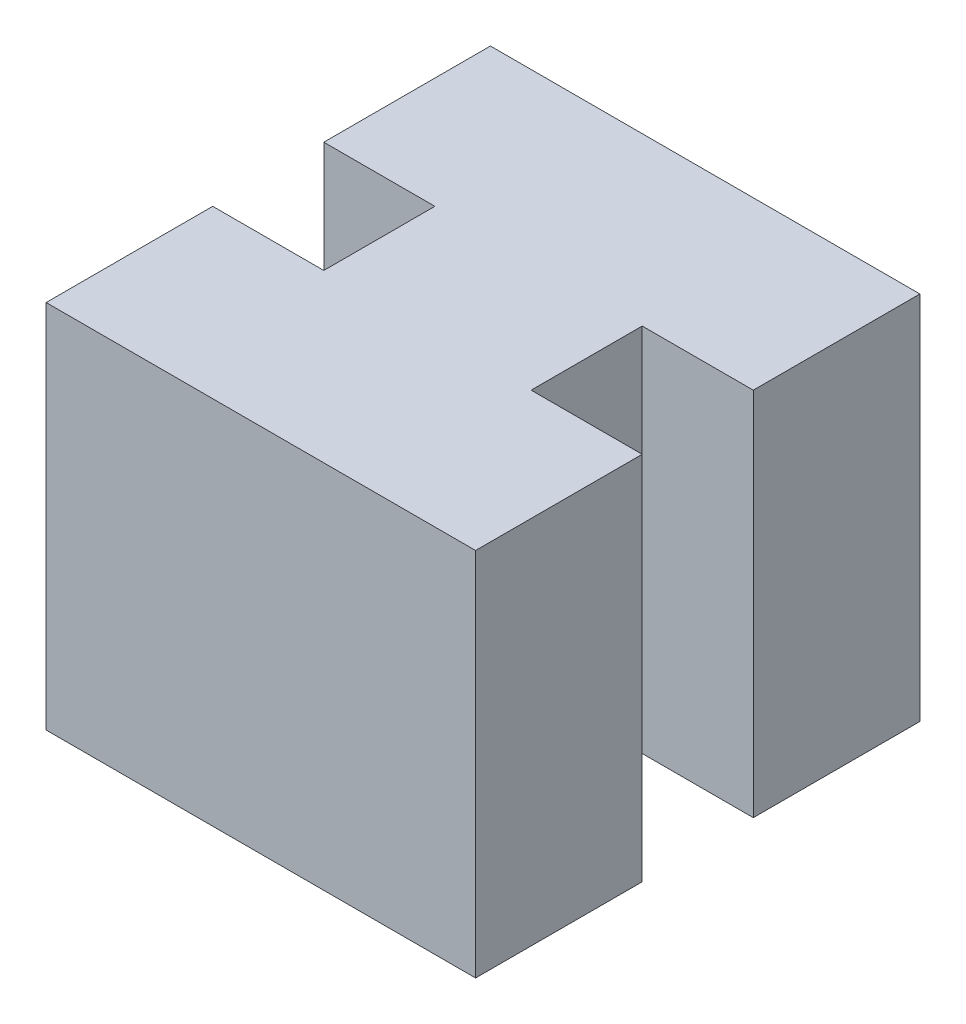
ISO-10303-21;
HEADER;
FILE_DESCRIPTION(('STEP AP214'),'2;1');
FILE_NAME('part.step','',(''),(''),'','','');
FILE_SCHEMA(('AUTOMOTIVE_DESIGN { 1 0 10303 214 1 1 1 1 }'));
ENDSEC;
DATA;
#1=APPLICATION_CONTEXT('core data for automotive mechanical design processes');
#2=APPLICATION_PROTOCOL_DEFINITION('international standard','automotive_design',2000,#1);
#3=PRODUCT_CONTEXT('',#1,'mechanical');
#4=PRODUCT('Part','Part','',(#3));
#5=PRODUCT_RELATED_PRODUCT_CATEGORY('part','',(#4));
#6=PRODUCT_DEFINITION_FORMATION('','',#4);
#7=PRODUCT_DEFINITION_CONTEXT('part definition',#1,'design');
#8=PRODUCT_DEFINITION('design','',#6,#7);
#9=PRODUCT_DEFINITION_SHAPE('','',#8);
#10=(LENGTH_UNIT() NAMED_UNIT(*) SI_UNIT(.MILLI.,.METRE.));
#11=(NAMED_UNIT(*) PLANE_ANGLE_UNIT() SI_UNIT($,.RADIAN.));
#12=(NAMED_UNIT(*) SI_UNIT($,.STERADIAN.) SOLID_ANGLE_UNIT());
#13=UNCERTAINTY_MEASURE_WITH_UNIT(LENGTH_MEASURE(1.E-05),#10,'distance_accuracy_value','');
#14=(GEOMETRIC_REPRESENTATION_CONTEXT(3) GLOBAL_UNCERTAINTY_ASSIGNED_CONTEXT((#13)) GLOBAL_UNIT_ASSIGNED_CONTEXT((#10,
#11,#12)) REPRESENTATION_CONTEXT('',''));
#15=CARTESIAN_POINT('',(0.,0.,0.));
#16=DIRECTION('',(0.,0.,1.));
#17=DIRECTION('',(1.,0.,0.));
#18=AXIS2_PLACEMENT_3D('',#15,#16,#17);
#19=CARTESIAN_POINT('',(0.,2.5,0.75));
#20=DIRECTION('',(0.,0.,-1.));
#21=DIRECTION('',(-1.,0.,0.));
#22=AXIS2_PLACEMENT_3D('',#19,#20,#21);
#23=PLANE('',#22);
#24=DIRECTION('',(1.,0.,0.));
#25=VECTOR('',#24,1.);
#26=CARTESIAN_POINT('',(0.,-2.5,0.75));
#27=LINE('',#26,#25);
#28=CARTESIAN_POINT('',(1.4,-2.5,0.75));
#29=VERTEX_POINT('',#28);
#30=CARTESIAN_POINT('',(2.9,-2.5,0.75));
#31=VERTEX_POINT('',#30);
#32=EDGE_CURVE('E154',#29,#31,#27,.T.);
#33=ORIENTED_EDGE('',*,*,#32,.F.);
#34=DIRECTION('',(0.,-1.,0.));
#35=VECTOR('',#34,1.);
#36=CARTESIAN_POINT('',(1.4,2.5,0.75));
#37=LINE('',#36,#35);
#38=CARTESIAN_POINT('',(1.4,2.5,0.75));
#39=VERTEX_POINT('',#38);
#40=EDGE_CURVE('E11',#39,#29,#37,.T.);
#41=ORIENTED_EDGE('',*,*,#40,.F.);
#42=DIRECTION('',(1.,0.,0.));
#43=VECTOR('',#42,1.);
#44=CARTESIAN_POINT('',(0.,2.5,0.75));
#45=LINE('',#44,#43);
#46=CARTESIAN_POINT('',(2.9,2.5,0.75));
#47=VERTEX_POINT('',#46);
#48=EDGE_CURVE('E214',#39,#47,#45,.T.);
#49=ORIENTED_EDGE('',*,*,#48,.T.);
#50=DIRECTION('',(0.,-1.,0.));
#51=VECTOR('',#50,1.);
#52=CARTESIAN_POINT('',(2.9,2.5,0.75));
#53=LINE('',#52,#51);
#54=EDGE_CURVE('E51',#47,#31,#53,.T.);
#55=ORIENTED_EDGE('',*,*,#54,.T.);
#56=EDGE_LOOP('',(#33,#41,#49,#55));
#57=FACE_BOUND('',#56,.T.);
#58=ADVANCED_FACE('F35',(#57),#23,.T.);
#59=CARTESIAN_POINT('',(1.4,2.5,0.));
#60=DIRECTION('',(1.,0.,0.));
#61=DIRECTION('',(0.,0.,-1.));
#62=AXIS2_PLACEMENT_3D('',#59,#60,#61);
#63=PLANE('',#62);
#64=DIRECTION('',(0.,0.,1.));
#65=VECTOR('',#64,1.);
#66=CARTESIAN_POINT('',(1.4,-2.5,0.));
#67=LINE('',#66,#65);
#68=CARTESIAN_POINT('',(1.4,-2.5,-0.75));
#69=VERTEX_POINT('',#68);
#70=EDGE_CURVE('E156',#69,#29,#67,.T.);
#71=ORIENTED_EDGE('',*,*,#70,.F.);
#72=DIRECTION('',(0.,-1.,0.));
#73=VECTOR('',#72,1.);
#74=CARTESIAN_POINT('',(1.4,2.5,-0.75));
#75=LINE('',#74,#73);
#76=CARTESIAN_POINT('',(1.4,2.5,-0.75));
#77=VERTEX_POINT('',#76);
#78=EDGE_CURVE('E43',#77,#69,#75,.T.);
#79=ORIENTED_EDGE('',*,*,#78,.F.);
#80=DIRECTION('',(0.,0.,1.));
#81=VECTOR('',#80,1.);
#82=CARTESIAN_POINT('',(1.4,2.5,0.));
#83=LINE('',#82,#81);
#84=EDGE_CURVE('E211',#77,#39,#83,.T.);
#85=ORIENTED_EDGE('',*,*,#84,.T.);
#86=ORIENTED_EDGE('',*,*,#40,.T.);
#87=EDGE_LOOP('',(#71,#79,#85,#86));
#88=FACE_BOUND('',#87,.T.);
#89=ADVANCED_FACE('F210',(#88),#63,.T.);
#90=CARTESIAN_POINT('',(0.,2.5,-0.75));
#91=DIRECTION('',(0.,0.,-1.));
#92=DIRECTION('',(-1.,0.,0.));
#93=AXIS2_PLACEMENT_3D('',#90,#91,#92);
#94=PLANE('',#93);
#95=DIRECTION('',(1.,0.,0.));
#96=VECTOR('',#95,1.);
#97=CARTESIAN_POINT('',(0.,-2.5,-0.75));
#98=LINE('',#97,#96);
#99=CARTESIAN_POINT('',(2.9,-2.5,-0.75));
#100=VERTEX_POINT('',#99);
#101=EDGE_CURVE('E159',#69,#100,#98,.T.);
#102=ORIENTED_EDGE('',*,*,#101,.T.);
#103=DIRECTION('',(0.,-1.,0.));
#104=VECTOR('',#103,1.);
#105=CARTESIAN_POINT('',(2.9,2.5,-0.75));
#106=LINE('',#105,#104);
#107=CARTESIAN_POINT('',(2.9,2.5,-0.75));
#108=VERTEX_POINT('',#107);
#109=EDGE_CURVE('E196',#108,#100,#106,.T.);
#110=ORIENTED_EDGE('',*,*,#109,.F.);
#111=DIRECTION('',(1.,0.,0.));
#112=VECTOR('',#111,1.);
#113=CARTESIAN_POINT('',(0.,2.5,-0.75));
#114=LINE('',#113,#112);
#115=EDGE_CURVE('E202',#77,#108,#114,.T.);
#116=ORIENTED_EDGE('',*,*,#115,.F.);
#117=ORIENTED_EDGE('',*,*,#78,.T.);
#118=EDGE_LOOP('',(#102,#110,#116,#117));
#119=FACE_BOUND('',#118,.T.);
#120=ADVANCED_FACE('F200',(#119),#94,.F.);
#121=CARTESIAN_POINT('',(2.9,2.5,0.));
#122=DIRECTION('',(1.,0.,0.));
#123=DIRECTION('',(0.,0.,-1.));
#124=AXIS2_PLACEMENT_3D('',#121,#122,#123);
#125=PLANE('',#124);
#126=DIRECTION('',(0.,0.,1.));
#127=VECTOR('',#126,1.);
#128=CARTESIAN_POINT('',(2.9,-2.5,0.));
#129=LINE('',#128,#127);
#130=CARTESIAN_POINT('',(2.9,-2.5,-3.));
#131=VERTEX_POINT('',#130);
#132=EDGE_CURVE('E162',#131,#100,#129,.T.);
#133=ORIENTED_EDGE('',*,*,#132,.F.);
#134=DIRECTION('',(0.,-1.,0.));
#135=VECTOR('',#134,1.);
#136=CARTESIAN_POINT('',(2.9,2.5,-3.));
#137=LINE('',#136,#135);
#138=CARTESIAN_POINT('',(2.9,2.5,-3.));
#139=VERTEX_POINT('',#138);
#140=EDGE_CURVE('E194',#139,#131,#137,.T.);
#141=ORIENTED_EDGE('',*,*,#140,.F.);
#142=DIRECTION('',(0.,0.,1.));
#143=VECTOR('',#142,1.);
#144=CARTESIAN_POINT('',(2.9,2.5,0.));
#145=LINE('',#144,#143);
#146=EDGE_CURVE('E150',#139,#108,#145,.T.);
#147=ORIENTED_EDGE('',*,*,#146,.T.);
#148=ORIENTED_EDGE('',*,*,#109,.T.);
#149=EDGE_LOOP('',(#133,#141,#147,#148));
#150=FACE_BOUND('',#149,.T.);
#151=ADVANCED_FACE('F249',(#150),#125,.T.);
#152=CARTESIAN_POINT('',(0.,2.5,-3.));
#153=DIRECTION('',(0.,0.,-1.));
#154=DIRECTION('',(-1.,0.,0.));
#155=AXIS2_PLACEMENT_3D('',#152,#153,#154);
#156=PLANE('',#155);
#157=DIRECTION('',(1.,0.,0.));
#158=VECTOR('',#157,1.);
#159=CARTESIAN_POINT('',(0.,-2.5,-3.));
#160=LINE('',#159,#158);
#161=CARTESIAN_POINT('',(-2.9,-2.5,-3.));
#162=VERTEX_POINT('',#161);
#163=EDGE_CURVE('E165',#162,#131,#160,.T.);
#164=ORIENTED_EDGE('',*,*,#163,.F.);
#165=DIRECTION('',(0.,-1.,0.));
#166=VECTOR('',#165,1.);
#167=CARTESIAN_POINT('',(-2.9,2.5,-3.));
#168=LINE('',#167,#166);
#169=CARTESIAN_POINT('',(-2.9,2.5,-3.));
#170=VERTEX_POINT('',#169);
#171=EDGE_CURVE('E192',#170,#162,#168,.T.);
#172=ORIENTED_EDGE('',*,*,#171,.F.);
#173=DIRECTION('',(1.,0.,0.));
#174=VECTOR('',#173,1.);
#175=CARTESIAN_POINT('',(0.,2.5,-3.));
#176=LINE('',#175,#174);
#177=EDGE_CURVE('E220',#170,#139,#176,.T.);
#178=ORIENTED_EDGE('',*,*,#177,.T.);
#179=ORIENTED_EDGE('',*,*,#140,.T.);
#180=EDGE_LOOP('',(#164,#172,#178,#179));
#181=FACE_BOUND('',#180,.T.);
#182=ADVANCED_FACE('F246',(#181),#156,.T.);
#183=CARTESIAN_POINT('',(-2.9,2.5,0.));
#184=DIRECTION('',(1.,0.,0.));
#185=DIRECTION('',(0.,0.,-1.));
#186=AXIS2_PLACEMENT_3D('',#183,#184,#185);
#187=PLANE('',#186);
#188=DIRECTION('',(0.,0.,1.));
#189=VECTOR('',#188,1.);
#190=CARTESIAN_POINT('',(-2.9,-2.5,0.));
#191=LINE('',#190,#189);
#192=CARTESIAN_POINT('',(-2.9,-2.5,-0.75));
#193=VERTEX_POINT('',#192);
#194=EDGE_CURVE('E169',#162,#193,#191,.T.);
#195=ORIENTED_EDGE('',*,*,#194,.T.);
#196=DIRECTION('',(0.,-1.,0.));
#197=VECTOR('',#196,1.);
#198=CARTESIAN_POINT('',(-2.9,2.5,-0.75));
#199=LINE('',#198,#197);
#200=CARTESIAN_POINT('',(-2.9,2.5,-0.75));
#201=VERTEX_POINT('',#200);
#202=EDGE_CURVE('E189',#201,#193,#199,.T.);
#203=ORIENTED_EDGE('',*,*,#202,.F.);
#204=DIRECTION('',(0.,0.,1.));
#205=VECTOR('',#204,1.);
#206=CARTESIAN_POINT('',(-2.9,2.5,0.));
#207=LINE('',#206,#205);
#208=EDGE_CURVE('E136',#170,#201,#207,.T.);
#209=ORIENTED_EDGE('',*,*,#208,.F.);
#210=ORIENTED_EDGE('',*,*,#171,.T.);
#211=EDGE_LOOP('',(#195,#203,#209,#210));
#212=FACE_BOUND('',#211,.T.);
#213=ADVANCED_FACE('F242',(#212),#187,.F.);
#214=CARTESIAN_POINT('',(0.,2.5,-0.75));
#215=DIRECTION('',(0.,0.,-1.));
#216=DIRECTION('',(-1.,0.,0.));
#217=AXIS2_PLACEMENT_3D('',#214,#215,#216);
#218=PLANE('',#217);
#219=DIRECTION('',(1.,0.,0.));
#220=VECTOR('',#219,1.);
#221=CARTESIAN_POINT('',(0.,-2.5,-0.75));
#222=LINE('',#221,#220);
#223=CARTESIAN_POINT('',(-1.4,-2.5,-0.75));
#224=VERTEX_POINT('',#223);
#225=EDGE_CURVE('E171',#193,#224,#222,.T.);
#226=ORIENTED_EDGE('',*,*,#225,.T.);
#227=DIRECTION('',(0.,-1.,0.));
#228=VECTOR('',#227,1.);
#229=CARTESIAN_POINT('',(-1.4,2.5,-0.75));
#230=LINE('',#229,#228);
#231=CARTESIAN_POINT('',(-1.4,2.5,-0.75));
#232=VERTEX_POINT('',#231);
#233=EDGE_CURVE('E186',#232,#224,#230,.T.);
#234=ORIENTED_EDGE('',*,*,#233,.F.);
#235=DIRECTION('',(1.,0.,0.));
#236=VECTOR('',#235,1.);
#237=CARTESIAN_POINT('',(0.,2.5,-0.75));
#238=LINE('',#237,#236);
#239=EDGE_CURVE('E223',#201,#232,#238,.T.);
#240=ORIENTED_EDGE('',*,*,#239,.F.);
#241=ORIENTED_EDGE('',*,*,#202,.T.);
#242=EDGE_LOOP('',(#226,#234,#240,#241));
#243=FACE_BOUND('',#242,.T.);
#244=ADVANCED_FACE('F238',(#243),#218,.F.);
#245=CARTESIAN_POINT('',(-1.4,2.5,0.));
#246=DIRECTION('',(1.,0.,0.));
#247=DIRECTION('',(0.,0.,-1.));
#248=AXIS2_PLACEMENT_3D('',#245,#246,#247);
#249=PLANE('',#248);
#250=DIRECTION('',(0.,0.,1.));
#251=VECTOR('',#250,1.);
#252=CARTESIAN_POINT('',(-1.4,-2.5,0.));
#253=LINE('',#252,#251);
#254=CARTESIAN_POINT('',(-1.4,-2.5,0.75));
#255=VERTEX_POINT('',#254);
#256=EDGE_CURVE('E173',#224,#255,#253,.T.);
#257=ORIENTED_EDGE('',*,*,#256,.T.);
#258=DIRECTION('',(0.,-1.,0.));
#259=VECTOR('',#258,1.);
#260=CARTESIAN_POINT('',(-1.4,2.5,0.75));
#261=LINE('',#260,#259);
#262=CARTESIAN_POINT('',(-1.4,2.5,0.75));
#263=VERTEX_POINT('',#262);
#264=EDGE_CURVE('E184',#263,#255,#261,.T.);
#265=ORIENTED_EDGE('',*,*,#264,.F.);
#266=DIRECTION('',(0.,0.,1.));
#267=VECTOR('',#266,1.);
#268=CARTESIAN_POINT('',(-1.4,2.5,0.));
#269=LINE('',#268,#267);
#270=EDGE_CURVE('E224',#232,#263,#269,.T.);
#271=ORIENTED_EDGE('',*,*,#270,.F.);
#272=ORIENTED_EDGE('',*,*,#233,.T.);
#273=EDGE_LOOP('',(#257,#265,#271,#272));
#274=FACE_BOUND('',#273,.T.);
#275=ADVANCED_FACE('F234',(#274),#249,.F.);
#276=CARTESIAN_POINT('',(0.,2.5,0.75));
#277=DIRECTION('',(0.,0.,-1.));
#278=DIRECTION('',(-1.,0.,0.));
#279=AXIS2_PLACEMENT_3D('',#276,#277,#278);
#280=PLANE('',#279);
#281=DIRECTION('',(1.,0.,0.));
#282=VECTOR('',#281,1.);
#283=CARTESIAN_POINT('',(0.,-2.5,0.75));
#284=LINE('',#283,#282);
#285=CARTESIAN_POINT('',(-2.9,-2.5,0.75));
#286=VERTEX_POINT('',#285);
#287=EDGE_CURVE('E176',#286,#255,#284,.T.);
#288=ORIENTED_EDGE('',*,*,#287,.F.);
#289=DIRECTION('',(0.,-1.,0.));
#290=VECTOR('',#289,1.);
#291=CARTESIAN_POINT('',(-2.9,2.5,0.75));
#292=LINE('',#291,#290);
#293=CARTESIAN_POINT('',(-2.9,2.5,0.75));
#294=VERTEX_POINT('',#293);
#295=EDGE_CURVE('E144',#294,#286,#292,.T.);
#296=ORIENTED_EDGE('',*,*,#295,.F.);
#297=DIRECTION('',(1.,0.,0.));
#298=VECTOR('',#297,1.);
#299=CARTESIAN_POINT('',(0.,2.5,0.75));
#300=LINE('',#299,#298);
#301=EDGE_CURVE('E133',#294,#263,#300,.T.);
#302=ORIENTED_EDGE('',*,*,#301,.T.);
#303=ORIENTED_EDGE('',*,*,#264,.T.);
#304=EDGE_LOOP('',(#288,#296,#302,#303));
#305=FACE_BOUND('',#304,.T.);
#306=ADVANCED_FACE('F229',(#305),#280,.T.);
#307=CARTESIAN_POINT('',(-2.9,-2.5,3.));
#308=VERTEX_POINT('',#307);
#309=EDGE_CURVE('E141',#286,#308,#191,.T.);
#310=ORIENTED_EDGE('',*,*,#309,.T.);
#311=DIRECTION('',(0.,-1.,0.));
#312=VECTOR('',#311,1.);
#313=CARTESIAN_POINT('',(-2.9,2.5,3.));
#314=LINE('',#313,#312);
#315=CARTESIAN_POINT('',(-2.9,2.5,3.));
#316=VERTEX_POINT('',#315);
#317=EDGE_CURVE('E138',#316,#308,#314,.T.);
#318=ORIENTED_EDGE('',*,*,#317,.F.);
#319=EDGE_CURVE('E126',#294,#316,#207,.T.);
#320=ORIENTED_EDGE('',*,*,#319,.F.);
#321=ORIENTED_EDGE('',*,*,#295,.T.);
#322=EDGE_LOOP('',(#310,#318,#320,#321));
#323=FACE_BOUND('',#322,.T.);
#324=ADVANCED_FACE('F139',(#323),#187,.F.);
#325=CARTESIAN_POINT('',(0.,2.5,3.));
#326=DIRECTION('',(0.,0.,-1.));
#327=DIRECTION('',(-1.,0.,0.));
#328=AXIS2_PLACEMENT_3D('',#325,#326,#327);
#329=PLANE('',#328);
#330=DIRECTION('',(1.,0.,0.));
#331=VECTOR('',#330,1.);
#332=CARTESIAN_POINT('',(0.,-2.5,3.));
#333=LINE('',#332,#331);
#334=CARTESIAN_POINT('',(2.9,-2.5,3.));
#335=VERTEX_POINT('',#334);
#336=EDGE_CURVE('E179',#308,#335,#333,.T.);
#337=ORIENTED_EDGE('',*,*,#336,.T.);
#338=DIRECTION('',(0.,-1.,0.));
#339=VECTOR('',#338,1.);
#340=CARTESIAN_POINT('',(2.9,2.5,3.));
#341=LINE('',#340,#339);
#342=CARTESIAN_POINT('',(2.9,2.5,3.));
#343=VERTEX_POINT('',#342);
#344=EDGE_CURVE('E89',#343,#335,#341,.T.);
#345=ORIENTED_EDGE('',*,*,#344,.F.);
#346=DIRECTION('',(1.,0.,0.));
#347=VECTOR('',#346,1.);
#348=CARTESIAN_POINT('',(0.,2.5,3.));
#349=LINE('',#348,#347);
#350=EDGE_CURVE('E131',#316,#343,#349,.T.);
#351=ORIENTED_EDGE('',*,*,#350,.F.);
#352=ORIENTED_EDGE('',*,*,#317,.T.);
#353=EDGE_LOOP('',(#337,#345,#351,#352));
#354=FACE_BOUND('',#353,.T.);
#355=ADVANCED_FACE('F146',(#354),#329,.F.);
#356=EDGE_CURVE('E166',#31,#335,#129,.T.);
#357=ORIENTED_EDGE('',*,*,#356,.F.);
#358=ORIENTED_EDGE('',*,*,#54,.F.);
#359=EDGE_CURVE('E147',#47,#343,#145,.T.);
#360=ORIENTED_EDGE('',*,*,#359,.T.);
#361=ORIENTED_EDGE('',*,*,#344,.T.);
#362=EDGE_LOOP('',(#357,#358,#360,#361));
#363=FACE_BOUND('',#362,.T.);
#364=ADVANCED_FACE('F213',(#363),#125,.T.);
#365=CARTESIAN_POINT('',(0.,2.5,0.));
#366=DIRECTION('',(0.,1.,0.));
#367=DIRECTION('',(0.,0.,1.));
#368=AXIS2_PLACEMENT_3D('',#365,#366,#367);
#369=PLANE('',#368);
#370=ORIENTED_EDGE('',*,*,#48,.F.);
#371=ORIENTED_EDGE('',*,*,#84,.F.);
#372=ORIENTED_EDGE('',*,*,#115,.T.);
#373=ORIENTED_EDGE('',*,*,#146,.F.);
#374=ORIENTED_EDGE('',*,*,#177,.F.);
#375=ORIENTED_EDGE('',*,*,#208,.T.);
#376=ORIENTED_EDGE('',*,*,#239,.T.);
#377=ORIENTED_EDGE('',*,*,#270,.T.);
#378=ORIENTED_EDGE('',*,*,#301,.F.);
#379=ORIENTED_EDGE('',*,*,#319,.T.);
#380=ORIENTED_EDGE('',*,*,#350,.T.);
#381=ORIENTED_EDGE('',*,*,#359,.F.);
#382=EDGE_LOOP('',(#370,#371,#372,#373,#374,#375,#376,#377,#378,#379,#380,#381));
#383=FACE_BOUND('',#382,.T.);
#384=ADVANCED_FACE('F128',(#383),#369,.T.);
#385=CARTESIAN_POINT('',(0.,-2.5,0.));
#386=DIRECTION('',(0.,1.,0.));
#387=DIRECTION('',(0.,0.,1.));
#388=AXIS2_PLACEMENT_3D('',#385,#386,#387);
#389=PLANE('',#388);
#390=ORIENTED_EDGE('',*,*,#32,.T.);
#391=ORIENTED_EDGE('',*,*,#356,.T.);
#392=ORIENTED_EDGE('',*,*,#336,.F.);
#393=ORIENTED_EDGE('',*,*,#309,.F.);
#394=ORIENTED_EDGE('',*,*,#287,.T.);
#395=ORIENTED_EDGE('',*,*,#256,.F.);
#396=ORIENTED_EDGE('',*,*,#225,.F.);
#397=ORIENTED_EDGE('',*,*,#194,.F.);
#398=ORIENTED_EDGE('',*,*,#163,.T.);
#399=ORIENTED_EDGE('',*,*,#132,.T.);
#400=ORIENTED_EDGE('',*,*,#101,.F.);
#401=ORIENTED_EDGE('',*,*,#70,.T.);
#402=EDGE_LOOP('',(#390,#391,#392,#393,#394,#395,#396,#397,#398,#399,#400,#401));
#403=FACE_BOUND('',#402,.T.);
#404=ADVANCED_FACE('F208',(#403),#389,.F.);
#405=CLOSED_SHELL('',(#58,#89,#120,#151,#182,#213,#244,#275,#306,#324,#355,#364,#384,#404));
#406=MANIFOLD_SOLID_BREP('B2',#405);
#407=ADVANCED_BREP_SHAPE_REPRESENTATION('',(#18,#406),#14);
#408=SHAPE_DEFINITION_REPRESENTATION(#9,#407);
ENDSEC;
END-ISO-10303-21;
